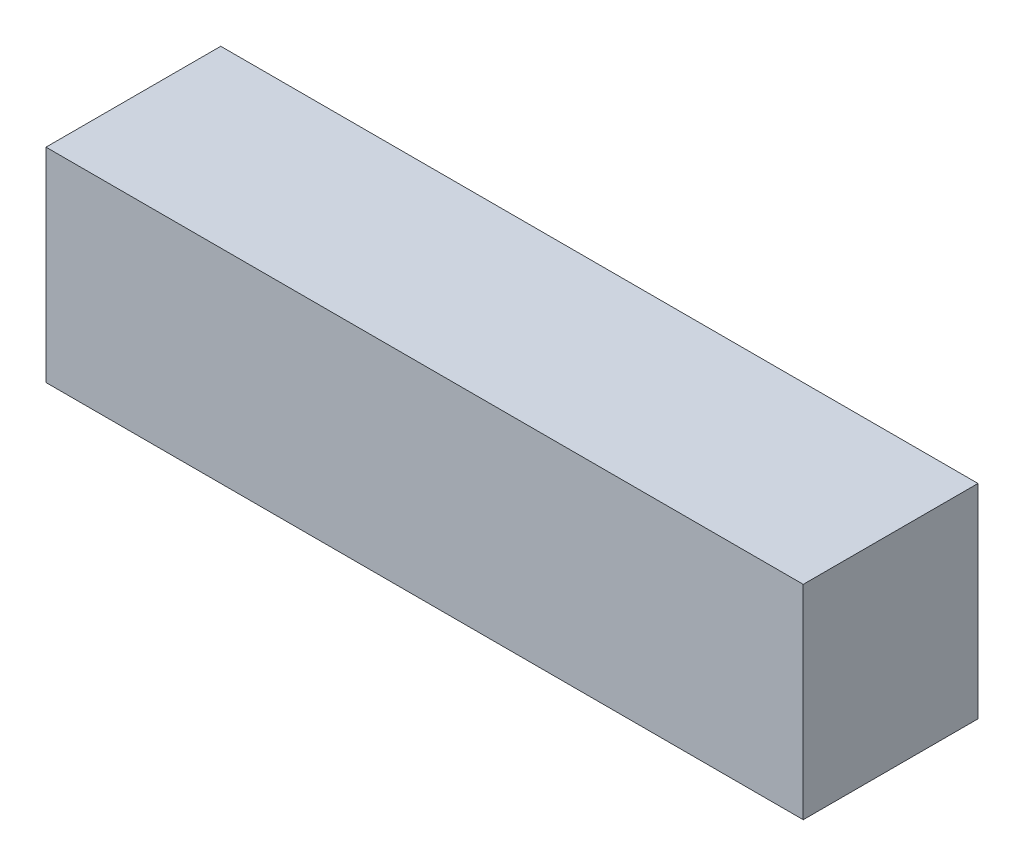
ISO-10303-21;
HEADER;
FILE_DESCRIPTION(('STEP AP214'),'2;1');
FILE_NAME('part.step','',(''),(''),'','','');
FILE_SCHEMA(('AUTOMOTIVE_DESIGN { 1 0 10303 214 1 1 1 1 }'));
ENDSEC;
DATA;
#1=APPLICATION_CONTEXT('core data for automotive mechanical design processes');
#2=APPLICATION_PROTOCOL_DEFINITION('international standard','automotive_design',2000,#1);
#3=PRODUCT_CONTEXT('',#1,'mechanical');
#4=PRODUCT('Part','Part','',(#3));
#5=PRODUCT_RELATED_PRODUCT_CATEGORY('part','',(#4));
#6=PRODUCT_DEFINITION_FORMATION('','',#4);
#7=PRODUCT_DEFINITION_CONTEXT('part definition',#1,'design');
#8=PRODUCT_DEFINITION('design','',#6,#7);
#9=PRODUCT_DEFINITION_SHAPE('','',#8);
#10=(LENGTH_UNIT() NAMED_UNIT(*) SI_UNIT(.MILLI.,.METRE.));
#11=(NAMED_UNIT(*) PLANE_ANGLE_UNIT() SI_UNIT($,.RADIAN.));
#12=(NAMED_UNIT(*) SI_UNIT($,.STERADIAN.) SOLID_ANGLE_UNIT());
#13=UNCERTAINTY_MEASURE_WITH_UNIT(LENGTH_MEASURE(1.E-05),#10,'distance_accuracy_value','');
#14=(GEOMETRIC_REPRESENTATION_CONTEXT(3) GLOBAL_UNCERTAINTY_ASSIGNED_CONTEXT((#13)) GLOBAL_UNIT_ASSIGNED_CONTEXT((#10,
#11,#12)) REPRESENTATION_CONTEXT('',''));
#15=CARTESIAN_POINT('',(0.,0.,0.));
#16=DIRECTION('',(0.,0.,1.));
#17=DIRECTION('',(1.,0.,0.));
#18=AXIS2_PLACEMENT_3D('',#15,#16,#17);
#19=CARTESIAN_POINT('',(0.,0.,25.));
#20=DIRECTION('',(0.,0.,1.));
#21=DIRECTION('',(1.,0.,0.));
#22=AXIS2_PLACEMENT_3D('',#19,#20,#21);
#23=PLANE('',#22);
#24=CARTESIAN_POINT('',(22.5,7.5,25.));
#25=DIRECTION('',(0.,0.,1.));
#26=DIRECTION('',(1.,0.,0.));
#27=AXIS2_PLACEMENT_3D('',#24,#25,#26);
#28=CIRCLE('',#27,2.5);
#29=CARTESIAN_POINT('',(22.5,5.,25.));
#30=VERTEX_POINT('',#29);
#31=CARTESIAN_POINT('',(20.,7.5,25.));
#32=VERTEX_POINT('',#31);
#33=EDGE_CURVE('E20',#30,#32,#28,.F.);
#34=ORIENTED_EDGE('',*,*,#33,.T.);
#35=DIRECTION('',(0.,-1.,0.));
#36=VECTOR('',#35,1.);
#37=CARTESIAN_POINT('',(20.,30.,25.));
#38=LINE('',#37,#36);
#39=CARTESIAN_POINT('',(20.,27.5,25.));
#40=VERTEX_POINT('',#39);
#41=EDGE_CURVE('E109',#32,#40,#38,.F.);
#42=ORIENTED_EDGE('',*,*,#41,.T.);
#43=CARTESIAN_POINT('',(22.5,27.5,25.));
#44=DIRECTION('',(0.,0.,1.));
#45=DIRECTION('',(1.,0.,0.));
#46=AXIS2_PLACEMENT_3D('',#43,#44,#45);
#47=CIRCLE('',#46,2.5);
#48=CARTESIAN_POINT('',(22.5,30.,25.));
#49=VERTEX_POINT('',#48);
#50=EDGE_CURVE('E146',#40,#49,#47,.F.);
#51=ORIENTED_EDGE('',*,*,#50,.T.);
#52=DIRECTION('',(1.,0.,0.));
#53=VECTOR('',#52,1.);
#54=CARTESIAN_POINT('',(20.,30.,25.));
#55=LINE('',#54,#53);
#56=CARTESIAN_POINT('',(42.5,30.,25.));
#57=VERTEX_POINT('',#56);
#58=EDGE_CURVE('E150',#49,#57,#55,.T.);
#59=ORIENTED_EDGE('',*,*,#58,.T.);
#60=CARTESIAN_POINT('',(42.5,27.5,25.));
#61=DIRECTION('',(0.,0.,1.));
#62=DIRECTION('',(1.,0.,0.));
#63=AXIS2_PLACEMENT_3D('',#60,#61,#62);
#64=CIRCLE('',#63,2.5);
#65=CARTESIAN_POINT('',(45.,27.5,25.));
#66=VERTEX_POINT('',#65);
#67=EDGE_CURVE('E148',#57,#66,#64,.F.);
#68=ORIENTED_EDGE('',*,*,#67,.T.);
#69=DIRECTION('',(0.,1.,0.));
#70=VECTOR('',#69,1.);
#71=CARTESIAN_POINT('',(45.,30.,25.));
#72=LINE('',#71,#70);
#73=CARTESIAN_POINT('',(45.,7.5,25.));
#74=VERTEX_POINT('',#73);
#75=EDGE_CURVE('E131',#66,#74,#72,.F.);
#76=ORIENTED_EDGE('',*,*,#75,.T.);
#77=CARTESIAN_POINT('',(42.5,7.5,25.));
#78=DIRECTION('',(0.,0.,1.));
#79=DIRECTION('',(1.,0.,0.));
#80=AXIS2_PLACEMENT_3D('',#77,#78,#79);
#81=CIRCLE('',#80,2.5);
#82=CARTESIAN_POINT('',(42.5,5.,25.));
#83=VERTEX_POINT('',#82);
#84=EDGE_CURVE('E152',#74,#83,#81,.F.);
#85=ORIENTED_EDGE('',*,*,#84,.T.);
#86=DIRECTION('',(1.,0.,0.));
#87=VECTOR('',#86,1.);
#88=CARTESIAN_POINT('',(20.,5.,25.));
#89=LINE('',#88,#87);
#90=EDGE_CURVE('E124',#83,#30,#89,.F.);
#91=ORIENTED_EDGE('',*,*,#90,.T.);
#92=EDGE_LOOP('',(#34,#42,#51,#59,#68,#76,#85,#91));
#93=FACE_BOUND('',#92,.T.);
#94=ADVANCED_FACE('F17',(#93),#23,.F.);
#95=CARTESIAN_POINT('',(20.,30.,25.));
#96=DIRECTION('',(-1.,0.,0.));
#97=DIRECTION('',(0.,-1.,0.));
#98=AXIS2_PLACEMENT_3D('',#95,#96,#97);
#99=PLANE('',#98);
#100=DIRECTION('',(0.,0.,1.));
#101=VECTOR('',#100,1.);
#102=CARTESIAN_POINT('',(20.,7.50000000000001,25.));
#103=LINE('',#102,#101);
#104=CARTESIAN_POINT('',(20.,7.5,0.));
#105=VERTEX_POINT('',#104);
#106=EDGE_CURVE('E112',#32,#105,#103,.F.);
#107=ORIENTED_EDGE('',*,*,#106,.T.);
#108=DIRECTION('',(0.,1.,0.));
#109=VECTOR('',#108,1.);
#110=CARTESIAN_POINT('',(20.,0.,0.));
#111=LINE('',#110,#109);
#112=CARTESIAN_POINT('',(20.,27.5,0.));
#113=VERTEX_POINT('',#112);
#114=EDGE_CURVE('E145',#113,#105,#111,.F.);
#115=ORIENTED_EDGE('',*,*,#114,.F.);
#116=DIRECTION('',(0.,0.,1.));
#117=VECTOR('',#116,1.);
#118=CARTESIAN_POINT('',(20.,27.5,25.));
#119=LINE('',#118,#117);
#120=EDGE_CURVE('E114',#113,#40,#119,.T.);
#121=ORIENTED_EDGE('',*,*,#120,.T.);
#122=ORIENTED_EDGE('',*,*,#41,.F.);
#123=EDGE_LOOP('',(#107,#115,#121,#122));
#124=FACE_BOUND('',#123,.T.);
#125=ADVANCED_FACE('F110',(#124),#99,.F.);
#126=CARTESIAN_POINT('',(22.5,7.5,25.));
#127=DIRECTION('',(0.,0.,1.));
#128=DIRECTION('',(1.,0.,0.));
#129=AXIS2_PLACEMENT_3D('',#126,#127,#128);
#130=CYLINDRICAL_SURFACE('',#129,2.5);
#131=DIRECTION('',(0.,0.,1.));
#132=VECTOR('',#131,1.);
#133=CARTESIAN_POINT('',(22.5,5.,25.));
#134=LINE('',#133,#132);
#135=CARTESIAN_POINT('',(22.5,5.,0.));
#136=VERTEX_POINT('',#135);
#137=EDGE_CURVE('E125',#30,#136,#134,.F.);
#138=ORIENTED_EDGE('',*,*,#137,.T.);
#139=CARTESIAN_POINT('',(22.5,7.5,0.));
#140=DIRECTION('',(0.,0.,1.));
#141=DIRECTION('',(1.,0.,0.));
#142=AXIS2_PLACEMENT_3D('',#139,#140,#141);
#143=CIRCLE('',#142,2.5);
#144=EDGE_CURVE('E120',#105,#136,#143,.T.);
#145=ORIENTED_EDGE('',*,*,#144,.F.);
#146=ORIENTED_EDGE('',*,*,#106,.F.);
#147=ORIENTED_EDGE('',*,*,#33,.F.);
#148=EDGE_LOOP('',(#138,#145,#146,#147));
#149=FACE_BOUND('',#148,.T.);
#150=ADVANCED_FACE('F119',(#149),#130,.F.);
#151=CARTESIAN_POINT('',(20.,5.,25.));
#152=DIRECTION('',(0.,-1.,0.));
#153=DIRECTION('',(1.,0.,0.));
#154=AXIS2_PLACEMENT_3D('',#151,#152,#153);
#155=PLANE('',#154);
#156=ORIENTED_EDGE('',*,*,#137,.F.);
#157=ORIENTED_EDGE('',*,*,#90,.F.);
#158=DIRECTION('',(0.,0.,1.));
#159=VECTOR('',#158,1.);
#160=CARTESIAN_POINT('',(42.5,5.,25.));
#161=LINE('',#160,#159);
#162=CARTESIAN_POINT('',(42.5,5.,0.));
#163=VERTEX_POINT('',#162);
#164=EDGE_CURVE('E127',#83,#163,#161,.F.);
#165=ORIENTED_EDGE('',*,*,#164,.T.);
#166=DIRECTION('',(-1.,0.,0.));
#167=VECTOR('',#166,1.);
#168=CARTESIAN_POINT('',(0.,5.,0.));
#169=LINE('',#168,#167);
#170=EDGE_CURVE('E143',#136,#163,#169,.F.);
#171=ORIENTED_EDGE('',*,*,#170,.F.);
#172=EDGE_LOOP('',(#156,#157,#165,#171));
#173=FACE_BOUND('',#172,.T.);
#174=ADVANCED_FACE('F330',(#173),#155,.F.);
#175=CARTESIAN_POINT('',(42.5,7.5,25.));
#176=DIRECTION('',(0.,0.,1.));
#177=DIRECTION('',(1.,0.,0.));
#178=AXIS2_PLACEMENT_3D('',#175,#176,#177);
#179=CYLINDRICAL_SURFACE('',#178,2.5);
#180=DIRECTION('',(0.,0.,-1.));
#181=VECTOR('',#180,1.);
#182=CARTESIAN_POINT('',(45.,7.5,25.));
#183=LINE('',#182,#181);
#184=CARTESIAN_POINT('',(45.,7.5,0.));
#185=VERTEX_POINT('',#184);
#186=EDGE_CURVE('E154',#74,#185,#183,.T.);
#187=ORIENTED_EDGE('',*,*,#186,.T.);
#188=CARTESIAN_POINT('',(42.5,7.5,0.));
#189=DIRECTION('',(0.,0.,1.));
#190=DIRECTION('',(1.,0.,0.));
#191=AXIS2_PLACEMENT_3D('',#188,#189,#190);
#192=CIRCLE('',#191,2.5);
#193=EDGE_CURVE('E141',#163,#185,#192,.T.);
#194=ORIENTED_EDGE('',*,*,#193,.F.);
#195=ORIENTED_EDGE('',*,*,#164,.F.);
#196=ORIENTED_EDGE('',*,*,#84,.F.);
#197=EDGE_LOOP('',(#187,#194,#195,#196));
#198=FACE_BOUND('',#197,.T.);
#199=ADVANCED_FACE('F182',(#198),#179,.F.);
#200=CARTESIAN_POINT('',(45.,30.,25.));
#201=DIRECTION('',(1.,0.,0.));
#202=DIRECTION('',(0.,0.,-1.));
#203=AXIS2_PLACEMENT_3D('',#200,#201,#202);
#204=PLANE('',#203);
#205=ORIENTED_EDGE('',*,*,#186,.F.);
#206=ORIENTED_EDGE('',*,*,#75,.F.);
#207=DIRECTION('',(0.,0.,1.));
#208=VECTOR('',#207,1.);
#209=CARTESIAN_POINT('',(45.,27.5,25.));
#210=LINE('',#209,#208);
#211=CARTESIAN_POINT('',(45.,27.5,0.));
#212=VERTEX_POINT('',#211);
#213=EDGE_CURVE('E151',#66,#212,#210,.F.);
#214=ORIENTED_EDGE('',*,*,#213,.T.);
#215=DIRECTION('',(0.,1.,0.));
#216=VECTOR('',#215,1.);
#217=CARTESIAN_POINT('',(45.,0.,0.));
#218=LINE('',#217,#216);
#219=EDGE_CURVE('E140',#185,#212,#218,.T.);
#220=ORIENTED_EDGE('',*,*,#219,.F.);
#221=EDGE_LOOP('',(#205,#206,#214,#220));
#222=FACE_BOUND('',#221,.T.);
#223=ADVANCED_FACE('F183',(#222),#204,.F.);
#224=CARTESIAN_POINT('',(42.5,27.5,25.));
#225=DIRECTION('',(0.,0.,1.));
#226=DIRECTION('',(1.,0.,0.));
#227=AXIS2_PLACEMENT_3D('',#224,#225,#226);
#228=CYLINDRICAL_SURFACE('',#227,2.5);
#229=DIRECTION('',(0.,0.,1.));
#230=VECTOR('',#229,1.);
#231=CARTESIAN_POINT('',(42.5,30.,25.));
#232=LINE('',#231,#230);
#233=CARTESIAN_POINT('',(42.5,30.,0.));
#234=VERTEX_POINT('',#233);
#235=EDGE_CURVE('E164',#57,#234,#232,.F.);
#236=ORIENTED_EDGE('',*,*,#235,.T.);
#237=CARTESIAN_POINT('',(42.5,27.5,0.));
#238=DIRECTION('',(0.,0.,1.));
#239=DIRECTION('',(1.,0.,0.));
#240=AXIS2_PLACEMENT_3D('',#237,#238,#239);
#241=CIRCLE('',#240,2.5);
#242=EDGE_CURVE('E138',#212,#234,#241,.T.);
#243=ORIENTED_EDGE('',*,*,#242,.F.);
#244=ORIENTED_EDGE('',*,*,#213,.F.);
#245=ORIENTED_EDGE('',*,*,#67,.F.);
#246=EDGE_LOOP('',(#236,#243,#244,#245));
#247=FACE_BOUND('',#246,.T.);
#248=ADVANCED_FACE('F198',(#247),#228,.F.);
#249=CARTESIAN_POINT('',(20.,30.,25.));
#250=DIRECTION('',(0.,1.,0.));
#251=DIRECTION('',(0.,0.,1.));
#252=AXIS2_PLACEMENT_3D('',#249,#250,#251);
#253=PLANE('',#252);
#254=ORIENTED_EDGE('',*,*,#235,.F.);
#255=ORIENTED_EDGE('',*,*,#58,.F.);
#256=DIRECTION('',(0.,0.,1.));
#257=VECTOR('',#256,1.);
#258=CARTESIAN_POINT('',(22.5,30.,25.));
#259=LINE('',#258,#257);
#260=CARTESIAN_POINT('',(22.5,30.,0.));
#261=VERTEX_POINT('',#260);
#262=EDGE_CURVE('E166',#49,#261,#259,.F.);
#263=ORIENTED_EDGE('',*,*,#262,.T.);
#264=DIRECTION('',(-1.,0.,0.));
#265=VECTOR('',#264,1.);
#266=CARTESIAN_POINT('',(0.,30.,0.));
#267=LINE('',#266,#265);
#268=EDGE_CURVE('E137',#234,#261,#267,.T.);
#269=ORIENTED_EDGE('',*,*,#268,.F.);
#270=EDGE_LOOP('',(#254,#255,#263,#269));
#271=FACE_BOUND('',#270,.T.);
#272=ADVANCED_FACE('F196',(#271),#253,.F.);
#273=CARTESIAN_POINT('',(22.5,27.5,25.));
#274=DIRECTION('',(0.,0.,1.));
#275=DIRECTION('',(1.,0.,0.));
#276=AXIS2_PLACEMENT_3D('',#273,#274,#275);
#277=CYLINDRICAL_SURFACE('',#276,2.5);
#278=ORIENTED_EDGE('',*,*,#120,.F.);
#279=CARTESIAN_POINT('',(22.5,27.5,0.));
#280=DIRECTION('',(0.,0.,1.));
#281=DIRECTION('',(1.,0.,0.));
#282=AXIS2_PLACEMENT_3D('',#279,#280,#281);
#283=CIRCLE('',#282,2.5);
#284=EDGE_CURVE('E133',#261,#113,#283,.T.);
#285=ORIENTED_EDGE('',*,*,#284,.F.);
#286=ORIENTED_EDGE('',*,*,#262,.F.);
#287=ORIENTED_EDGE('',*,*,#50,.F.);
#288=EDGE_LOOP('',(#278,#285,#286,#287));
#289=FACE_BOUND('',#288,.T.);
#290=ADVANCED_FACE('F194',(#289),#277,.F.);
#291=CARTESIAN_POINT('',(0.,0.,0.));
#292=DIRECTION('',(0.,0.,-1.));
#293=DIRECTION('',(-1.,0.,0.));
#294=AXIS2_PLACEMENT_3D('',#291,#292,#293);
#295=PLANE('',#294);
#296=DIRECTION('',(0.,1.,0.));
#297=VECTOR('',#296,1.);
#298=CARTESIAN_POINT('',(130.,0.,0.));
#299=LINE('',#298,#297);
#300=CARTESIAN_POINT('',(130.,35.,0.));
#301=VERTEX_POINT('',#300);
#302=CARTESIAN_POINT('',(130.,0.,0.));
#303=VERTEX_POINT('',#302);
#304=EDGE_CURVE('E235',#301,#303,#299,.F.);
#305=ORIENTED_EDGE('',*,*,#304,.T.);
#306=DIRECTION('',(1.,0.,0.));
#307=VECTOR('',#306,1.);
#308=CARTESIAN_POINT('',(0.,0.,0.));
#309=LINE('',#308,#307);
#310=CARTESIAN_POINT('',(0.,0.,0.));
#311=VERTEX_POINT('',#310);
#312=EDGE_CURVE('E238',#303,#311,#309,.F.);
#313=ORIENTED_EDGE('',*,*,#312,.T.);
#314=DIRECTION('',(0.,1.,0.));
#315=VECTOR('',#314,1.);
#316=CARTESIAN_POINT('',(0.,0.,0.));
#317=LINE('',#316,#315);
#318=CARTESIAN_POINT('',(0.,35.,0.));
#319=VERTEX_POINT('',#318);
#320=EDGE_CURVE('E259',#311,#319,#317,.T.);
#321=ORIENTED_EDGE('',*,*,#320,.T.);
#322=DIRECTION('',(1.,0.,0.));
#323=VECTOR('',#322,1.);
#324=CARTESIAN_POINT('',(0.,35.,0.));
#325=LINE('',#324,#323);
#326=EDGE_CURVE('E136',#319,#301,#325,.T.);
#327=ORIENTED_EDGE('',*,*,#326,.T.);
#328=EDGE_LOOP('',(#305,#313,#321,#327));
#329=FACE_BOUND('',#328,.T.);
#330=ORIENTED_EDGE('',*,*,#268,.T.);
#331=ORIENTED_EDGE('',*,*,#284,.T.);
#332=ORIENTED_EDGE('',*,*,#114,.T.);
#333=ORIENTED_EDGE('',*,*,#144,.T.);
#334=ORIENTED_EDGE('',*,*,#170,.T.);
#335=ORIENTED_EDGE('',*,*,#193,.T.);
#336=ORIENTED_EDGE('',*,*,#219,.T.);
#337=ORIENTED_EDGE('',*,*,#242,.T.);
#338=EDGE_LOOP('',(#330,#331,#332,#333,#334,#335,#336,#337));
#339=FACE_BOUND('',#338,.T.);
#340=ADVANCED_FACE('F190',(#329,#339),#295,.T.);
#341=CARTESIAN_POINT('',(0.,35.,30.));
#342=DIRECTION('',(0.,-1.,0.));
#343=DIRECTION('',(0.,0.,-1.));
#344=AXIS2_PLACEMENT_3D('',#341,#342,#343);
#345=PLANE('',#344);
#346=DIRECTION('',(0.,0.,-1.));
#347=VECTOR('',#346,1.);
#348=CARTESIAN_POINT('',(0.,35.,30.));
#349=LINE('',#348,#347);
#350=CARTESIAN_POINT('',(0.,35.,30.));
#351=VERTEX_POINT('',#350);
#352=EDGE_CURVE('E245',#319,#351,#349,.F.);
#353=ORIENTED_EDGE('',*,*,#352,.T.);
#354=DIRECTION('',(-1.,0.,0.));
#355=VECTOR('',#354,1.);
#356=CARTESIAN_POINT('',(0.,35.,30.));
#357=LINE('',#356,#355);
#358=CARTESIAN_POINT('',(130.,35.,30.));
#359=VERTEX_POINT('',#358);
#360=EDGE_CURVE('E256',#351,#359,#357,.F.);
#361=ORIENTED_EDGE('',*,*,#360,.T.);
#362=DIRECTION('',(0.,0.,1.));
#363=VECTOR('',#362,1.);
#364=CARTESIAN_POINT('',(130.,35.,30.));
#365=LINE('',#364,#363);
#366=EDGE_CURVE('E242',#359,#301,#365,.F.);
#367=ORIENTED_EDGE('',*,*,#366,.T.);
#368=ORIENTED_EDGE('',*,*,#326,.F.);
#369=EDGE_LOOP('',(#353,#361,#367,#368));
#370=FACE_BOUND('',#369,.T.);
#371=ADVANCED_FACE('F225',(#370),#345,.F.);
#372=CARTESIAN_POINT('',(130.,0.,30.));
#373=DIRECTION('',(-1.,0.,0.));
#374=DIRECTION('',(0.,0.,1.));
#375=AXIS2_PLACEMENT_3D('',#372,#373,#374);
#376=PLANE('',#375);
#377=ORIENTED_EDGE('',*,*,#366,.F.);
#378=DIRECTION('',(0.,1.,0.));
#379=VECTOR('',#378,1.);
#380=CARTESIAN_POINT('',(130.,0.,30.));
#381=LINE('',#380,#379);
#382=CARTESIAN_POINT('',(130.,0.,30.));
#383=VERTEX_POINT('',#382);
#384=EDGE_CURVE('E249',#359,#383,#381,.F.);
#385=ORIENTED_EDGE('',*,*,#384,.T.);
#386=DIRECTION('',(0.,0.,1.));
#387=VECTOR('',#386,1.);
#388=CARTESIAN_POINT('',(130.,0.,30.));
#389=LINE('',#388,#387);
#390=EDGE_CURVE('E241',#383,#303,#389,.F.);
#391=ORIENTED_EDGE('',*,*,#390,.T.);
#392=ORIENTED_EDGE('',*,*,#304,.F.);
#393=EDGE_LOOP('',(#377,#385,#391,#392));
#394=FACE_BOUND('',#393,.T.);
#395=ADVANCED_FACE('F221',(#394),#376,.F.);
#396=CARTESIAN_POINT('',(0.,0.,30.));
#397=DIRECTION('',(0.,1.,0.));
#398=DIRECTION('',(0.,0.,1.));
#399=AXIS2_PLACEMENT_3D('',#396,#397,#398);
#400=PLANE('',#399);
#401=ORIENTED_EDGE('',*,*,#390,.F.);
#402=DIRECTION('',(-1.,0.,0.));
#403=VECTOR('',#402,1.);
#404=CARTESIAN_POINT('',(0.,0.,30.));
#405=LINE('',#404,#403);
#406=CARTESIAN_POINT('',(0.,0.,30.));
#407=VERTEX_POINT('',#406);
#408=EDGE_CURVE('E26',#383,#407,#405,.T.);
#409=ORIENTED_EDGE('',*,*,#408,.T.);
#410=DIRECTION('',(0.,0.,-1.));
#411=VECTOR('',#410,1.);
#412=CARTESIAN_POINT('',(0.,0.,30.));
#413=LINE('',#412,#411);
#414=EDGE_CURVE('E34',#407,#311,#413,.T.);
#415=ORIENTED_EDGE('',*,*,#414,.T.);
#416=ORIENTED_EDGE('',*,*,#312,.F.);
#417=EDGE_LOOP('',(#401,#409,#415,#416));
#418=FACE_BOUND('',#417,.T.);
#419=ADVANCED_FACE('F215',(#418),#400,.F.);
#420=CARTESIAN_POINT('',(0.,0.,30.));
#421=DIRECTION('',(1.,0.,0.));
#422=DIRECTION('',(0.,0.,-1.));
#423=AXIS2_PLACEMENT_3D('',#420,#421,#422);
#424=PLANE('',#423);
#425=ORIENTED_EDGE('',*,*,#414,.F.);
#426=DIRECTION('',(0.,1.,0.));
#427=VECTOR('',#426,1.);
#428=CARTESIAN_POINT('',(0.,0.,30.));
#429=LINE('',#428,#427);
#430=EDGE_CURVE('E11',#407,#351,#429,.T.);
#431=ORIENTED_EDGE('',*,*,#430,.T.);
#432=ORIENTED_EDGE('',*,*,#352,.F.);
#433=ORIENTED_EDGE('',*,*,#320,.F.);
#434=EDGE_LOOP('',(#425,#431,#432,#433));
#435=FACE_BOUND('',#434,.T.);
#436=ADVANCED_FACE('F209',(#435),#424,.F.);
#437=CARTESIAN_POINT('',(0.,0.,30.));
#438=DIRECTION('',(0.,0.,-1.));
#439=DIRECTION('',(-1.,0.,0.));
#440=AXIS2_PLACEMENT_3D('',#437,#438,#439);
#441=PLANE('',#440);
#442=ORIENTED_EDGE('',*,*,#408,.F.);
#443=ORIENTED_EDGE('',*,*,#384,.F.);
#444=ORIENTED_EDGE('',*,*,#360,.F.);
#445=ORIENTED_EDGE('',*,*,#430,.F.);
#446=EDGE_LOOP('',(#442,#443,#444,#445));
#447=FACE_BOUND('',#446,.T.);
#448=ADVANCED_FACE('F207',(#447),#441,.F.);
#449=CLOSED_SHELL('',(#94,#125,#150,#174,#199,#223,#248,#272,#290,#340,#371,#395,#419,#436,#448));
#450=MANIFOLD_SOLID_BREP('B1',#449);
#451=ADVANCED_BREP_SHAPE_REPRESENTATION('',(#18,#450),#14);
#452=SHAPE_DEFINITION_REPRESENTATION(#9,#451);
ENDSEC;
END-ISO-10303-21;
